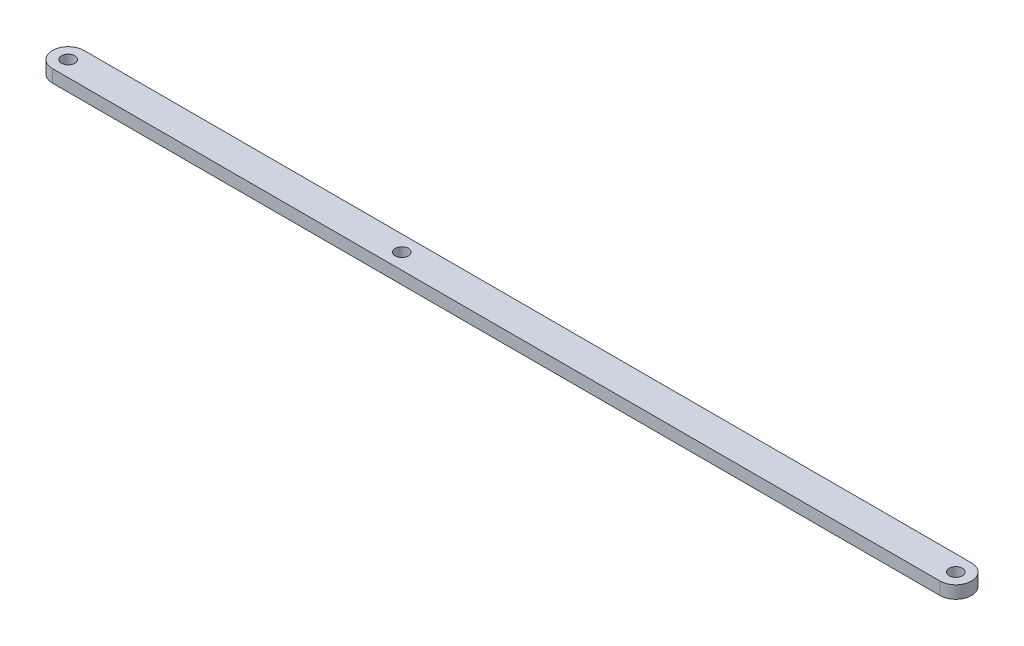
ISO-10303-21;
HEADER;
FILE_DESCRIPTION(('STEP AP214'),'2;1');
FILE_NAME('part.step','',(''),(''),'','','');
FILE_SCHEMA(('AUTOMOTIVE_DESIGN { 1 0 10303 214 1 1 1 1 }'));
ENDSEC;
DATA;
#1=APPLICATION_CONTEXT('core data for automotive mechanical design processes');
#2=APPLICATION_PROTOCOL_DEFINITION('international standard','automotive_design',2000,#1);
#3=PRODUCT_CONTEXT('',#1,'mechanical');
#4=PRODUCT('Part','Part','',(#3));
#5=PRODUCT_RELATED_PRODUCT_CATEGORY('part','',(#4));
#6=PRODUCT_DEFINITION_FORMATION('','',#4);
#7=PRODUCT_DEFINITION_CONTEXT('part definition',#1,'design');
#8=PRODUCT_DEFINITION('design','',#6,#7);
#9=PRODUCT_DEFINITION_SHAPE('','',#8);
#10=(LENGTH_UNIT() NAMED_UNIT(*) SI_UNIT(.MILLI.,.METRE.));
#11=(NAMED_UNIT(*) PLANE_ANGLE_UNIT() SI_UNIT($,.RADIAN.));
#12=(NAMED_UNIT(*) SI_UNIT($,.STERADIAN.) SOLID_ANGLE_UNIT());
#13=UNCERTAINTY_MEASURE_WITH_UNIT(LENGTH_MEASURE(1.E-05),#10,'distance_accuracy_value','');
#14=(GEOMETRIC_REPRESENTATION_CONTEXT(3) GLOBAL_UNCERTAINTY_ASSIGNED_CONTEXT((#13)) GLOBAL_UNIT_ASSIGNED_CONTEXT((#10,
#11,#12)) REPRESENTATION_CONTEXT('',''));
#15=CARTESIAN_POINT('',(0.,0.,0.));
#16=DIRECTION('',(0.,0.,1.));
#17=DIRECTION('',(1.,0.,0.));
#18=AXIS2_PLACEMENT_3D('',#15,#16,#17);
#19=CARTESIAN_POINT('',(0.,2.,0.));
#20=DIRECTION('',(0.,1.,0.));
#21=DIRECTION('',(0.,0.,1.));
#22=AXIS2_PLACEMENT_3D('',#19,#20,#21);
#23=PLANE('',#22);
#24=CARTESIAN_POINT('',(141.,2.,0.));
#25=DIRECTION('',(0.,1.,0.));
#26=DIRECTION('',(0.,0.,1.));
#27=AXIS2_PLACEMENT_3D('',#24,#25,#26);
#28=CIRCLE('',#27,1.04999999999999);
#29=CARTESIAN_POINT('',(141.,2.,1.04999999999999));
#30=VERTEX_POINT('',#29);
#31=EDGE_CURVE('E121',#30,#30,#28,.T.);
#32=ORIENTED_EDGE('',*,*,#31,.F.);
#33=EDGE_LOOP('',(#32));
#34=FACE_BOUND('',#33,.T.);
#35=CARTESIAN_POINT('',(0.,2.,0.));
#36=DIRECTION('',(0.,1.,0.));
#37=DIRECTION('',(0.,0.,1.));
#38=AXIS2_PLACEMENT_3D('',#35,#36,#37);
#39=CIRCLE('',#38,2.5);
#40=CARTESIAN_POINT('',(0.,2.,-2.5));
#41=VERTEX_POINT('',#40);
#42=CARTESIAN_POINT('',(0.,2.,2.5));
#43=VERTEX_POINT('',#42);
#44=EDGE_CURVE('E91',#41,#43,#39,.T.);
#45=ORIENTED_EDGE('',*,*,#44,.T.);
#46=DIRECTION('',(1.,0.,0.));
#47=VECTOR('',#46,1.);
#48=CARTESIAN_POINT('',(0.,2.,2.5));
#49=LINE('',#48,#47);
#50=CARTESIAN_POINT('',(141.,2.,2.5));
#51=VERTEX_POINT('',#50);
#52=EDGE_CURVE('E86',#43,#51,#49,.T.);
#53=ORIENTED_EDGE('',*,*,#52,.T.);
#54=CARTESIAN_POINT('',(141.,2.,0.));
#55=DIRECTION('',(0.,1.,0.));
#56=DIRECTION('',(0.,0.,1.));
#57=AXIS2_PLACEMENT_3D('',#54,#55,#56);
#58=CIRCLE('',#57,2.5);
#59=CARTESIAN_POINT('',(141.,2.,-2.5));
#60=VERTEX_POINT('',#59);
#61=EDGE_CURVE('E89',#51,#60,#58,.T.);
#62=ORIENTED_EDGE('',*,*,#61,.T.);
#63=DIRECTION('',(-1.,0.,0.));
#64=VECTOR('',#63,1.);
#65=CARTESIAN_POINT('',(0.,2.,-2.5));
#66=LINE('',#65,#64);
#67=EDGE_CURVE('E56',#60,#41,#66,.T.);
#68=ORIENTED_EDGE('',*,*,#67,.T.);
#69=EDGE_LOOP('',(#45,#53,#62,#68));
#70=FACE_BOUND('',#69,.T.);
#71=CARTESIAN_POINT('',(0.,2.,0.));
#72=DIRECTION('',(0.,1.,0.));
#73=DIRECTION('',(0.,0.,1.));
#74=AXIS2_PLACEMENT_3D('',#71,#72,#73);
#75=CIRCLE('',#74,1.05);
#76=CARTESIAN_POINT('',(0.,2.,1.05));
#77=VERTEX_POINT('',#76);
#78=EDGE_CURVE('E106',#77,#77,#75,.T.);
#79=ORIENTED_EDGE('',*,*,#78,.F.);
#80=EDGE_LOOP('',(#79));
#81=FACE_BOUND('',#80,.T.);
#82=CARTESIAN_POINT('',(53.,2.,0.));
#83=DIRECTION('',(0.,1.,0.));
#84=DIRECTION('',(0.,0.,1.));
#85=AXIS2_PLACEMENT_3D('',#82,#83,#84);
#86=CIRCLE('',#85,1.05);
#87=CARTESIAN_POINT('',(53.,2.,1.05));
#88=VERTEX_POINT('',#87);
#89=EDGE_CURVE('E127',#88,#88,#86,.T.);
#90=ORIENTED_EDGE('',*,*,#89,.F.);
#91=EDGE_LOOP('',(#90));
#92=FACE_BOUND('',#91,.T.);
#93=ADVANCED_FACE('F39',(#34,#70,#81,#92),#23,.T.);
#94=CARTESIAN_POINT('',(0.,0.,0.));
#95=DIRECTION('',(0.,1.,0.));
#96=DIRECTION('',(0.,0.,1.));
#97=AXIS2_PLACEMENT_3D('',#94,#95,#96);
#98=PLANE('',#97);
#99=CARTESIAN_POINT('',(0.,0.,0.));
#100=DIRECTION('',(0.,1.,0.));
#101=DIRECTION('',(0.,0.,1.));
#102=AXIS2_PLACEMENT_3D('',#99,#100,#101);
#103=CIRCLE('',#102,2.5);
#104=CARTESIAN_POINT('',(0.,0.,-2.5));
#105=VERTEX_POINT('',#104);
#106=CARTESIAN_POINT('',(0.,0.,2.5));
#107=VERTEX_POINT('',#106);
#108=EDGE_CURVE('E103',#105,#107,#103,.T.);
#109=ORIENTED_EDGE('',*,*,#108,.F.);
#110=DIRECTION('',(-1.,0.,0.));
#111=VECTOR('',#110,1.);
#112=CARTESIAN_POINT('',(0.,0.,-2.5));
#113=LINE('',#112,#111);
#114=CARTESIAN_POINT('',(141.,0.,-2.5));
#115=VERTEX_POINT('',#114);
#116=EDGE_CURVE('E79',#115,#105,#113,.T.);
#117=ORIENTED_EDGE('',*,*,#116,.F.);
#118=CARTESIAN_POINT('',(141.,0.,0.));
#119=DIRECTION('',(0.,1.,0.));
#120=DIRECTION('',(0.,0.,1.));
#121=AXIS2_PLACEMENT_3D('',#118,#119,#120);
#122=CIRCLE('',#121,2.5);
#123=CARTESIAN_POINT('',(141.,0.,2.5));
#124=VERTEX_POINT('',#123);
#125=EDGE_CURVE('E73',#124,#115,#122,.T.);
#126=ORIENTED_EDGE('',*,*,#125,.F.);
#127=DIRECTION('',(1.,0.,0.));
#128=VECTOR('',#127,1.);
#129=CARTESIAN_POINT('',(0.,0.,2.5));
#130=LINE('',#129,#128);
#131=EDGE_CURVE('E95',#107,#124,#130,.T.);
#132=ORIENTED_EDGE('',*,*,#131,.F.);
#133=EDGE_LOOP('',(#109,#117,#126,#132));
#134=FACE_BOUND('',#133,.T.);
#135=CARTESIAN_POINT('',(0.,0.,0.));
#136=DIRECTION('',(0.,1.,0.));
#137=DIRECTION('',(0.,0.,1.));
#138=AXIS2_PLACEMENT_3D('',#135,#136,#137);
#139=CIRCLE('',#138,1.05);
#140=CARTESIAN_POINT('',(0.,0.,1.05));
#141=VERTEX_POINT('',#140);
#142=EDGE_CURVE('E118',#141,#141,#139,.T.);
#143=ORIENTED_EDGE('',*,*,#142,.T.);
#144=EDGE_LOOP('',(#143));
#145=FACE_BOUND('',#144,.T.);
#146=CARTESIAN_POINT('',(141.,0.,0.));
#147=DIRECTION('',(0.,1.,0.));
#148=DIRECTION('',(0.,0.,1.));
#149=AXIS2_PLACEMENT_3D('',#146,#147,#148);
#150=CIRCLE('',#149,1.04999999999999);
#151=CARTESIAN_POINT('',(141.,0.,1.04999999999999));
#152=VERTEX_POINT('',#151);
#153=EDGE_CURVE('E124',#152,#152,#150,.T.);
#154=ORIENTED_EDGE('',*,*,#153,.T.);
#155=EDGE_LOOP('',(#154));
#156=FACE_BOUND('',#155,.T.);
#157=CARTESIAN_POINT('',(53.,0.,0.));
#158=DIRECTION('',(0.,1.,0.));
#159=DIRECTION('',(0.,0.,1.));
#160=AXIS2_PLACEMENT_3D('',#157,#158,#159);
#161=CIRCLE('',#160,1.05);
#162=CARTESIAN_POINT('',(53.,0.,1.05));
#163=VERTEX_POINT('',#162);
#164=EDGE_CURVE('E130',#163,#163,#161,.T.);
#165=ORIENTED_EDGE('',*,*,#164,.T.);
#166=EDGE_LOOP('',(#165));
#167=FACE_BOUND('',#166,.T.);
#168=ADVANCED_FACE('F114',(#134,#145,#156,#167),#98,.F.);
#169=CARTESIAN_POINT('',(0.,2.,0.));
#170=DIRECTION('',(0.,-1.,0.));
#171=DIRECTION('',(0.,0.,-1.));
#172=AXIS2_PLACEMENT_3D('',#169,#170,#171);
#173=CYLINDRICAL_SURFACE('',#172,2.5);
#174=ORIENTED_EDGE('',*,*,#108,.T.);
#175=DIRECTION('',(0.,-1.,0.));
#176=VECTOR('',#175,1.);
#177=CARTESIAN_POINT('',(0.,2.,2.5));
#178=LINE('',#177,#176);
#179=EDGE_CURVE('E11',#43,#107,#178,.T.);
#180=ORIENTED_EDGE('',*,*,#179,.F.);
#181=ORIENTED_EDGE('',*,*,#44,.F.);
#182=DIRECTION('',(0.,-1.,0.));
#183=VECTOR('',#182,1.);
#184=CARTESIAN_POINT('',(0.,2.,-2.5));
#185=LINE('',#184,#183);
#186=EDGE_CURVE('E99',#41,#105,#185,.T.);
#187=ORIENTED_EDGE('',*,*,#186,.T.);
#188=EDGE_LOOP('',(#174,#180,#181,#187));
#189=FACE_BOUND('',#188,.T.);
#190=ADVANCED_FACE('F41',(#189),#173,.T.);
#191=CARTESIAN_POINT('',(0.,2.,2.5));
#192=DIRECTION('',(0.,0.,-1.));
#193=DIRECTION('',(-1.,0.,0.));
#194=AXIS2_PLACEMENT_3D('',#191,#192,#193);
#195=PLANE('',#194);
#196=ORIENTED_EDGE('',*,*,#131,.T.);
#197=DIRECTION('',(0.,-1.,0.));
#198=VECTOR('',#197,1.);
#199=CARTESIAN_POINT('',(141.,2.,2.5));
#200=LINE('',#199,#198);
#201=EDGE_CURVE('E48',#51,#124,#200,.T.);
#202=ORIENTED_EDGE('',*,*,#201,.F.);
#203=ORIENTED_EDGE('',*,*,#52,.F.);
#204=ORIENTED_EDGE('',*,*,#179,.T.);
#205=EDGE_LOOP('',(#196,#202,#203,#204));
#206=FACE_BOUND('',#205,.T.);
#207=ADVANCED_FACE('F94',(#206),#195,.F.);
#208=CARTESIAN_POINT('',(141.,2.,0.));
#209=DIRECTION('',(0.,-1.,0.));
#210=DIRECTION('',(0.,0.,-1.));
#211=AXIS2_PLACEMENT_3D('',#208,#209,#210);
#212=CYLINDRICAL_SURFACE('',#211,2.5);
#213=ORIENTED_EDGE('',*,*,#125,.T.);
#214=DIRECTION('',(0.,-1.,0.));
#215=VECTOR('',#214,1.);
#216=CARTESIAN_POINT('',(141.,2.,-2.5));
#217=LINE('',#216,#215);
#218=EDGE_CURVE('E96',#60,#115,#217,.T.);
#219=ORIENTED_EDGE('',*,*,#218,.F.);
#220=ORIENTED_EDGE('',*,*,#61,.F.);
#221=ORIENTED_EDGE('',*,*,#201,.T.);
#222=EDGE_LOOP('',(#213,#219,#220,#221));
#223=FACE_BOUND('',#222,.T.);
#224=ADVANCED_FACE('F97',(#223),#212,.T.);
#225=CARTESIAN_POINT('',(0.,2.,-2.5));
#226=DIRECTION('',(0.,0.,1.));
#227=DIRECTION('',(1.,0.,0.));
#228=AXIS2_PLACEMENT_3D('',#225,#226,#227);
#229=PLANE('',#228);
#230=ORIENTED_EDGE('',*,*,#116,.T.);
#231=ORIENTED_EDGE('',*,*,#186,.F.);
#232=ORIENTED_EDGE('',*,*,#67,.F.);
#233=ORIENTED_EDGE('',*,*,#218,.T.);
#234=EDGE_LOOP('',(#230,#231,#232,#233));
#235=FACE_BOUND('',#234,.T.);
#236=ADVANCED_FACE('F111',(#235),#229,.F.);
#237=CARTESIAN_POINT('',(0.,2.,0.));
#238=DIRECTION('',(0.,-1.,0.));
#239=DIRECTION('',(0.,0.,-1.));
#240=AXIS2_PLACEMENT_3D('',#237,#238,#239);
#241=CYLINDRICAL_SURFACE('',#240,1.05);
#242=ORIENTED_EDGE('',*,*,#78,.T.);
#243=EDGE_LOOP('',(#242));
#244=FACE_BOUND('',#243,.T.);
#245=ORIENTED_EDGE('',*,*,#142,.F.);
#246=EDGE_LOOP('',(#245));
#247=FACE_BOUND('',#246,.T.);
#248=ADVANCED_FACE('F148',(#244,#247),#241,.F.);
#249=CARTESIAN_POINT('',(141.,2.,0.));
#250=DIRECTION('',(0.,-1.,0.));
#251=DIRECTION('',(0.,0.,-1.));
#252=AXIS2_PLACEMENT_3D('',#249,#250,#251);
#253=CYLINDRICAL_SURFACE('',#252,1.04999999999999);
#254=ORIENTED_EDGE('',*,*,#31,.T.);
#255=EDGE_LOOP('',(#254));
#256=FACE_BOUND('',#255,.T.);
#257=ORIENTED_EDGE('',*,*,#153,.F.);
#258=EDGE_LOOP('',(#257));
#259=FACE_BOUND('',#258,.T.);
#260=ADVANCED_FACE('F202',(#256,#259),#253,.F.);
#261=CARTESIAN_POINT('',(53.,2.,0.));
#262=DIRECTION('',(0.,-1.,0.));
#263=DIRECTION('',(0.,0.,-1.));
#264=AXIS2_PLACEMENT_3D('',#261,#262,#263);
#265=CYLINDRICAL_SURFACE('',#264,1.05);
#266=ORIENTED_EDGE('',*,*,#89,.T.);
#267=EDGE_LOOP('',(#266));
#268=FACE_BOUND('',#267,.T.);
#269=ORIENTED_EDGE('',*,*,#164,.F.);
#270=EDGE_LOOP('',(#269));
#271=FACE_BOUND('',#270,.T.);
#272=ADVANCED_FACE('F136',(#268,#271),#265,.F.);
#273=CLOSED_SHELL('',(#93,#168,#190,#207,#224,#236,#248,#260,#272));
#274=MANIFOLD_SOLID_BREP('B2',#273);
#275=ADVANCED_BREP_SHAPE_REPRESENTATION('',(#18,#274),#14);
#276=SHAPE_DEFINITION_REPRESENTATION(#9,#275);
ENDSEC;
END-ISO-10303-21;
